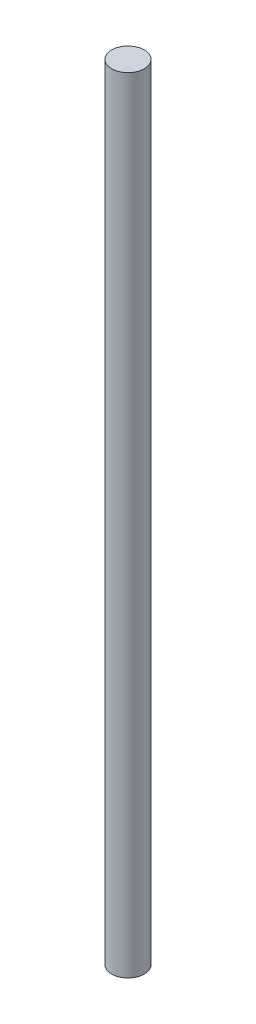
ISO-10303-21;
HEADER;
FILE_DESCRIPTION(('STEP AP214'),'2;1');
FILE_NAME('part.step','',(''),(''),'','','');
FILE_SCHEMA(('AUTOMOTIVE_DESIGN { 1 0 10303 214 1 1 1 1 }'));
ENDSEC;
DATA;
#1=APPLICATION_CONTEXT('core data for automotive mechanical design processes');
#2=APPLICATION_PROTOCOL_DEFINITION('international standard','automotive_design',2000,#1);
#3=PRODUCT_CONTEXT('',#1,'mechanical');
#4=PRODUCT('Part','Part','',(#3));
#5=PRODUCT_RELATED_PRODUCT_CATEGORY('part','',(#4));
#6=PRODUCT_DEFINITION_FORMATION('','',#4);
#7=PRODUCT_DEFINITION_CONTEXT('part definition',#1,'design');
#8=PRODUCT_DEFINITION('design','',#6,#7);
#9=PRODUCT_DEFINITION_SHAPE('','',#8);
#10=(LENGTH_UNIT() NAMED_UNIT(*) SI_UNIT(.MILLI.,.METRE.));
#11=(NAMED_UNIT(*) PLANE_ANGLE_UNIT() SI_UNIT($,.RADIAN.));
#12=(NAMED_UNIT(*) SI_UNIT($,.STERADIAN.) SOLID_ANGLE_UNIT());
#13=UNCERTAINTY_MEASURE_WITH_UNIT(LENGTH_MEASURE(1.E-05),#10,'distance_accuracy_value','');
#14=(GEOMETRIC_REPRESENTATION_CONTEXT(3) GLOBAL_UNCERTAINTY_ASSIGNED_CONTEXT((#13)) GLOBAL_UNIT_ASSIGNED_CONTEXT((#10,
#11,#12)) REPRESENTATION_CONTEXT('',''));
#15=CARTESIAN_POINT('',(0.,0.,0.));
#16=DIRECTION('',(0.,0.,1.));
#17=DIRECTION('',(1.,0.,0.));
#18=AXIS2_PLACEMENT_3D('',#15,#16,#17);
#19=CARTESIAN_POINT('',(0.,240.,0.));
#20=DIRECTION('',(0.,-1.,0.));
#21=DIRECTION('',(0.,0.,-1.));
#22=AXIS2_PLACEMENT_3D('',#19,#20,#21);
#23=CYLINDRICAL_SURFACE('',#22,5.);
#24=CARTESIAN_POINT('',(0.,240.,0.));
#25=DIRECTION('',(0.,1.,0.));
#26=DIRECTION('',(0.,0.,1.));
#27=AXIS2_PLACEMENT_3D('',#24,#25,#26);
#28=CIRCLE('',#27,5.);
#29=CARTESIAN_POINT('',(0.,240.,5.));
#30=VERTEX_POINT('',#29);
#31=EDGE_CURVE('E10',#30,#30,#28,.T.);
#32=ORIENTED_EDGE('',*,*,#31,.F.);
#33=EDGE_LOOP('',(#32));
#34=FACE_BOUND('',#33,.T.);
#35=CARTESIAN_POINT('',(0.,0.,0.));
#36=DIRECTION('',(0.,1.,0.));
#37=DIRECTION('',(0.,0.,1.));
#38=AXIS2_PLACEMENT_3D('',#35,#36,#37);
#39=CIRCLE('',#38,5.);
#40=CARTESIAN_POINT('',(0.,0.,5.));
#41=VERTEX_POINT('',#40);
#42=EDGE_CURVE('E32',#41,#41,#39,.T.);
#43=ORIENTED_EDGE('',*,*,#42,.T.);
#44=EDGE_LOOP('',(#43));
#45=FACE_BOUND('',#44,.T.);
#46=ADVANCED_FACE('F29',(#34,#45),#23,.T.);
#47=CARTESIAN_POINT('',(0.,240.,0.));
#48=DIRECTION('',(0.,1.,0.));
#49=DIRECTION('',(0.,0.,1.));
#50=AXIS2_PLACEMENT_3D('',#47,#48,#49);
#51=PLANE('',#50);
#52=ORIENTED_EDGE('',*,*,#31,.T.);
#53=EDGE_LOOP('',(#52));
#54=FACE_BOUND('',#53,.T.);
#55=ADVANCED_FACE('F44',(#54),#51,.T.);
#56=CARTESIAN_POINT('',(0.,0.,0.));
#57=DIRECTION('',(0.,1.,0.));
#58=DIRECTION('',(0.,0.,1.));
#59=AXIS2_PLACEMENT_3D('',#56,#57,#58);
#60=PLANE('',#59);
#61=ORIENTED_EDGE('',*,*,#42,.F.);
#62=EDGE_LOOP('',(#61));
#63=FACE_BOUND('',#62,.T.);
#64=ADVANCED_FACE('F42',(#63),#60,.F.);
#65=CLOSED_SHELL('',(#46,#55,#64));
#66=MANIFOLD_SOLID_BREP('B2',#65);
#67=ADVANCED_BREP_SHAPE_REPRESENTATION('',(#18,#66),#14);
#68=SHAPE_DEFINITION_REPRESENTATION(#9,#67);
ENDSEC;
END-ISO-10303-21;
